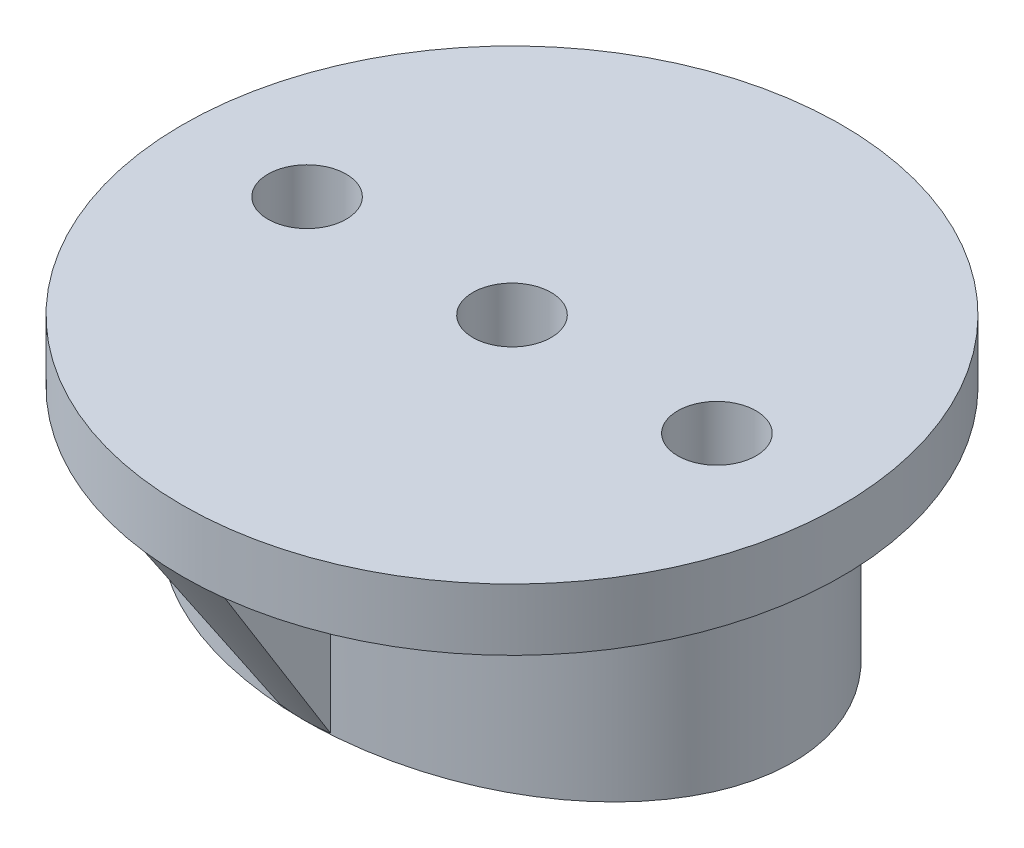
ISO-10303-21;
HEADER;
FILE_DESCRIPTION(('STEP AP214'),'2;1');
FILE_NAME('part.step','',(''),(''),'','','');
FILE_SCHEMA(('AUTOMOTIVE_DESIGN { 1 0 10303 214 1 1 1 1 }'));
ENDSEC;
DATA;
#1=APPLICATION_CONTEXT('core data for automotive mechanical design processes');
#2=APPLICATION_PROTOCOL_DEFINITION('international standard','automotive_design',2000,#1);
#3=PRODUCT_CONTEXT('',#1,'mechanical');
#4=PRODUCT('Part','Part','',(#3));
#5=PRODUCT_RELATED_PRODUCT_CATEGORY('part','',(#4));
#6=PRODUCT_DEFINITION_FORMATION('','',#4);
#7=PRODUCT_DEFINITION_CONTEXT('part definition',#1,'design');
#8=PRODUCT_DEFINITION('design','',#6,#7);
#9=PRODUCT_DEFINITION_SHAPE('','',#8);
#10=(LENGTH_UNIT() NAMED_UNIT(*) SI_UNIT(.MILLI.,.METRE.));
#11=(NAMED_UNIT(*) PLANE_ANGLE_UNIT() SI_UNIT($,.RADIAN.));
#12=(NAMED_UNIT(*) SI_UNIT($,.STERADIAN.) SOLID_ANGLE_UNIT());
#13=UNCERTAINTY_MEASURE_WITH_UNIT(LENGTH_MEASURE(1.E-05),#10,'distance_accuracy_value','');
#14=(GEOMETRIC_REPRESENTATION_CONTEXT(3) GLOBAL_UNCERTAINTY_ASSIGNED_CONTEXT((#13)) GLOBAL_UNIT_ASSIGNED_CONTEXT((#10,
#11,#12)) REPRESENTATION_CONTEXT('',''));
#15=CARTESIAN_POINT('',(0.,0.,0.));
#16=DIRECTION('',(0.,0.,1.));
#17=DIRECTION('',(1.,0.,0.));
#18=AXIS2_PLACEMENT_3D('',#15,#16,#17);
#19=CARTESIAN_POINT('',(0.,57.254833995939,0.));
#20=DIRECTION('',(0.,-1.,0.));
#21=DIRECTION('',(-1.,0.,0.));
#22=AXIS2_PLACEMENT_3D('',#19,#20,#21);
#23=ELLIPSE('',#22,13.6302171389891,10.0863606828519);
#24=DIRECTION('',(0.,-1.,0.));
#25=VECTOR('',#24,1.);
#26=SURFACE_OF_LINEAR_EXTRUSION('',#23,#25);
#27=CARTESIAN_POINT('',(1.233368705494,0.0518321276191582,-10.0449820109657));
#28=CARTESIAN_POINT('',(1.13072295889144,0.0432177595437114,-10.0518839833739));
#29=CARTESIAN_POINT('',(1.02793007242528,0.0356620341411071,-10.0579263881112));
#30=CARTESIAN_POINT('',(0.822343982897428,0.0227060251169006,-10.0682747195089));
#31=CARTESIAN_POINT('',(0.7195512563392,0.0173011390424472,-10.072584354228));
#32=CARTESIAN_POINT('',(0.513965318761181,0.00865393201673197,-10.0794745810961));
#33=CARTESIAN_POINT('',(0.411172321731632,0.0054085071540511,-10.0820576549497));
#34=CARTESIAN_POINT('',(0.205586180671322,0.0010823217772041,-10.0855000842118));
#35=CARTESIAN_POINT('',(0.102793090335661,0.,-10.0863606828519));
#36=CARTESIAN_POINT('',(-0.10279309033566,0.,-10.0863606828519));
#37=CARTESIAN_POINT('',(-0.20558618067132,0.00108232177720389,-10.0855000842118));
#38=CARTESIAN_POINT('',(-0.41117232173163,0.00540850715405112,-10.0820576549497));
#39=CARTESIAN_POINT('',(-0.513965318761179,0.00865393201673235,-10.0794745810961));
#40=CARTESIAN_POINT('',(-0.719551256339198,0.0173011390424493,-10.072584354228));
#41=CARTESIAN_POINT('',(-0.822343982897426,0.0227060251169041,-10.0682747195089));
#42=CARTESIAN_POINT('',(-1.02793007242528,0.03566203414111,-10.0579263881112));
#43=CARTESIAN_POINT('',(-1.13072295889144,0.0432177595437122,-10.0518839833739));
#44=CARTESIAN_POINT('',(-1.233368705494,0.051832127619153,-10.0449820109657));
#45=B_SPLINE_CURVE_WITH_KNOTS('',3,(#27,#28,#29,#30,#31,#32,#33,#34,#35,#36,#37,#38,#39,#40,#41,
#42,#43,#44),.UNSPECIFIED.,.F.,.F.,(4,2,2,2,2,2,2,2,4),(0.,0.309704305783665,0.61874228348996,
0.927335098939476,1.23570510077978,1.54407510262009,1.85266791806961,2.1617058957759,
2.47141020155957),.UNSPECIFIED.);
#46=CARTESIAN_POINT('',(0.,0.,-10.0863606828519));
#47=VERTEX_POINT('',#46);
#48=CARTESIAN_POINT('',(-1.233368705494,0.0518321276191591,-10.0449820109657));
#49=VERTEX_POINT('',#48);
#50=EDGE_CURVE('E194',#47,#49,#45,.T.);
#51=ORIENTED_EDGE('',*,*,#50,.F.);
#52=CARTESIAN_POINT('',(0.,0.,0.));
#53=DIRECTION('',(0.,-1.,0.));
#54=DIRECTION('',(-1.,0.,0.));
#55=AXIS2_PLACEMENT_3D('',#52,#53,#54);
#56=ELLIPSE('',#55,13.6302171389891,10.0863606828519);
#57=CARTESIAN_POINT('',(0.,0.,10.0863606828519));
#58=VERTEX_POINT('',#57);
#59=EDGE_CURVE('E241',#58,#47,#56,.T.);
#60=ORIENTED_EDGE('',*,*,#59,.F.);
#61=CARTESIAN_POINT('',(-1.233368705494,0.0518321276191591,10.0449820109657));
#62=CARTESIAN_POINT('',(-1.13072295889144,0.0432177595437092,10.0518839833739));
#63=CARTESIAN_POINT('',(-1.02793007242528,0.0356620341411055,10.0579263881112));
#64=CARTESIAN_POINT('',(-0.822343982897427,0.0227060251169015,10.0682747195089));
#65=CARTESIAN_POINT('',(-0.719551256339198,0.0173011390424502,10.072584354228));
#66=CARTESIAN_POINT('',(-0.513965318761179,0.00865393201673461,10.0794745810961));
#67=CARTESIAN_POINT('',(-0.41117232173163,0.00540850715405144,10.0820576549497));
#68=CARTESIAN_POINT('',(-0.20558618067132,0.0010823217772029,10.0855000842118));
#69=CARTESIAN_POINT('',(-0.102793090335659,0.,10.0863606828519));
#70=CARTESIAN_POINT('',(0.102793090335663,0.,10.0863606828519));
#71=CARTESIAN_POINT('',(0.205586180671323,0.00108232177720485,10.0855000842118));
#72=CARTESIAN_POINT('',(0.411172321731634,0.00540850715405157,10.0820576549497));
#73=CARTESIAN_POINT('',(0.513965318761183,0.00865393201673194,10.0794745810961));
#74=CARTESIAN_POINT('',(0.719551256339202,0.0173011390424469,10.072584354228));
#75=CARTESIAN_POINT('',(0.822343982897431,0.0227060251169006,10.0682747195089));
#76=CARTESIAN_POINT('',(1.02793007242529,0.035662034141108,10.0579263881112));
#77=CARTESIAN_POINT('',(1.13072295889145,0.0432177595437127,10.0518839833739));
#78=CARTESIAN_POINT('',(1.233368705494,0.05183212761916,10.0449820109657));
#79=B_SPLINE_CURVE_WITH_KNOTS('',3,(#61,#62,#63,#64,#65,#66,#67,#68,#69,#70,#71,#72,#73,#74,#75,
#76,#77,#78),.UNSPECIFIED.,.F.,.F.,(4,2,2,2,2,2,2,2,4),(0.,0.309704305783665,0.618742283489962,
0.927335098939477,1.23570510077979,1.54407510262009,1.85266791806961,2.16170589577591,
2.47141020155957),.UNSPECIFIED.);
#80=CARTESIAN_POINT('',(-1.233368705494,0.0518321276191591,10.0449820109657));
#81=VERTEX_POINT('',#80);
#82=EDGE_CURVE('E238',#81,#58,#79,.T.);
#83=ORIENTED_EDGE('',*,*,#82,.F.);
#84=DIRECTION('',(0.,-1.,0.));
#85=VECTOR('',#84,1.);
#86=CARTESIAN_POINT('',(-1.233368705494,4.5,10.0449820109657));
#87=LINE('',#86,#85);
#88=CARTESIAN_POINT('',(-1.233368705494,9.,10.0449820109657));
#89=VERTEX_POINT('',#88);
#90=EDGE_CURVE('E239',#81,#89,#87,.F.);
#91=ORIENTED_EDGE('',*,*,#90,.T.);
#92=CARTESIAN_POINT('',(0.,9.,0.));
#93=DIRECTION('',(0.,-1.,0.));
#94=DIRECTION('',(-1.,0.,0.));
#95=AXIS2_PLACEMENT_3D('',#92,#93,#94);
#96=ELLIPSE('',#95,13.6302171389891,10.0863606828519);
#97=CARTESIAN_POINT('',(-1.233368705494,9.,-10.0449820109657));
#98=VERTEX_POINT('',#97);
#99=EDGE_CURVE('E246',#89,#98,#96,.T.);
#100=ORIENTED_EDGE('',*,*,#99,.T.);
#101=DIRECTION('',(0.,-1.,0.));
#102=VECTOR('',#101,1.);
#103=CARTESIAN_POINT('',(-1.233368705494,4.49999999999985,-10.0449820109657));
#104=LINE('',#103,#102);
#105=EDGE_CURVE('E59',#98,#49,#104,.T.);
#106=ORIENTED_EDGE('',*,*,#105,.T.);
#107=EDGE_LOOP('',(#51,#60,#83,#91,#100,#106));
#108=FACE_BOUND('',#107,.T.);
#109=ADVANCED_FACE('F35',(#108),#26,.T.);
#110=CARTESIAN_POINT('',(0.,9.,0.));
#111=DIRECTION('',(0.,1.,0.));
#112=DIRECTION('',(0.,0.,1.));
#113=AXIS2_PLACEMENT_3D('',#110,#111,#112);
#114=PLANE('',#113);
#115=DIRECTION('',(-0.121869343405148,0.,-0.992546151641322));
#116=VECTOR('',#115,1.);
#117=CARTESIAN_POINT('',(-1.94990949448236,9.,-15.8807384262612));
#118=LINE('',#117,#116);
#119=CARTESIAN_POINT('',(-1.94990949448236,9.,-15.8807384262612));
#120=VERTEX_POINT('',#119);
#121=EDGE_CURVE('E185',#98,#120,#118,.T.);
#122=ORIENTED_EDGE('',*,*,#121,.F.);
#123=ORIENTED_EDGE('',*,*,#99,.F.);
#124=DIRECTION('',(0.121869343405148,0.,-0.992546151641322));
#125=VECTOR('',#124,1.);
#126=CARTESIAN_POINT('',(0.,9.,0.));
#127=LINE('',#126,#125);
#128=CARTESIAN_POINT('',(-1.94990949448236,9.,15.8807384262612));
#129=VERTEX_POINT('',#128);
#130=EDGE_CURVE('E12',#129,#89,#127,.T.);
#131=ORIENTED_EDGE('',*,*,#130,.F.);
#132=CARTESIAN_POINT('',(0.,9.,0.));
#133=DIRECTION('',(0.,1.,0.));
#134=DIRECTION('',(0.,0.,1.));
#135=AXIS2_PLACEMENT_3D('',#132,#133,#134);
#136=CIRCLE('',#135,16.);
#137=EDGE_CURVE('E249',#129,#120,#136,.F.);
#138=ORIENTED_EDGE('',*,*,#137,.T.);
#139=EDGE_LOOP('',(#122,#123,#131,#138));
#140=FACE_BOUND('',#139,.T.);
#141=ADVANCED_FACE('F312',(#140),#114,.F.);
#142=CARTESIAN_POINT('',(1.233368705494,0.0518321276191626,-10.0449820109657));
#143=VERTEX_POINT('',#142);
#144=EDGE_CURVE('E202',#143,#47,#45,.T.);
#145=ORIENTED_EDGE('',*,*,#144,.F.);
#146=DIRECTION('',(0.,-1.,0.));
#147=VECTOR('',#146,1.);
#148=CARTESIAN_POINT('',(1.233368705494,4.49999999999985,-10.0449820109657));
#149=LINE('',#148,#147);
#150=CARTESIAN_POINT('',(1.233368705494,9.,-10.0449820109657));
#151=VERTEX_POINT('',#150);
#152=EDGE_CURVE('E203',#151,#143,#149,.T.);
#153=ORIENTED_EDGE('',*,*,#152,.F.);
#154=CARTESIAN_POINT('',(1.233368705494,9.,10.0449820109657));
#155=VERTEX_POINT('',#154);
#156=EDGE_CURVE('E244',#151,#155,#96,.T.);
#157=ORIENTED_EDGE('',*,*,#156,.T.);
#158=DIRECTION('',(0.,-1.,0.));
#159=VECTOR('',#158,1.);
#160=CARTESIAN_POINT('',(1.233368705494,4.5,10.0449820109657));
#161=LINE('',#160,#159);
#162=CARTESIAN_POINT('',(1.233368705494,0.0518321276191626,10.0449820109657));
#163=VERTEX_POINT('',#162);
#164=EDGE_CURVE('E282',#163,#155,#161,.F.);
#165=ORIENTED_EDGE('',*,*,#164,.F.);
#166=EDGE_CURVE('E231',#58,#163,#79,.T.);
#167=ORIENTED_EDGE('',*,*,#166,.F.);
#168=EDGE_CURVE('E245',#47,#58,#56,.T.);
#169=ORIENTED_EDGE('',*,*,#168,.F.);
#170=EDGE_LOOP('',(#145,#153,#157,#165,#167,#169));
#171=FACE_BOUND('',#170,.T.);
#172=ADVANCED_FACE('F205',(#171),#26,.T.);
#173=ORIENTED_EDGE('',*,*,#156,.F.);
#174=DIRECTION('',(0.121869343405148,0.,-0.992546151641322));
#175=VECTOR('',#174,1.);
#176=CARTESIAN_POINT('',(1.94990949448236,9.,-15.8807384262612));
#177=LINE('',#176,#175);
#178=CARTESIAN_POINT('',(1.94990949448236,9.,-15.8807384262612));
#179=VERTEX_POINT('',#178);
#180=EDGE_CURVE('E179',#151,#179,#177,.T.);
#181=ORIENTED_EDGE('',*,*,#180,.T.);
#182=CARTESIAN_POINT('',(1.94990949448236,9.,15.8807384262612));
#183=VERTEX_POINT('',#182);
#184=EDGE_CURVE('E251',#179,#183,#136,.F.);
#185=ORIENTED_EDGE('',*,*,#184,.T.);
#186=DIRECTION('',(-0.121869343405148,0.,-0.992546151641322));
#187=VECTOR('',#186,1.);
#188=CARTESIAN_POINT('',(0.,9.,0.));
#189=LINE('',#188,#187);
#190=EDGE_CURVE('E44',#183,#155,#189,.T.);
#191=ORIENTED_EDGE('',*,*,#190,.T.);
#192=EDGE_LOOP('',(#173,#181,#185,#191));
#193=FACE_BOUND('',#192,.T.);
#194=ADVANCED_FACE('F275',(#193),#114,.F.);
#195=CARTESIAN_POINT('',(0.,0.,0.));
#196=DIRECTION('',(0.,1.,0.));
#197=DIRECTION('',(0.,0.,1.));
#198=AXIS2_PLACEMENT_3D('',#195,#196,#197);
#199=PLANE('',#198);
#200=DIRECTION('',(-0.5,0.,-0.866025403784439));
#201=VECTOR('',#200,1.);
#202=CARTESIAN_POINT('',(-3.46410161513775,0.,6.));
#203=LINE('',#202,#201);
#204=CARTESIAN_POINT('',(-3.46410161513775,0.,6.));
#205=VERTEX_POINT('',#204);
#206=CARTESIAN_POINT('',(-6.92820323027551,0.,0.));
#207=VERTEX_POINT('',#206);
#208=EDGE_CURVE('E515',#205,#207,#203,.T.);
#209=ORIENTED_EDGE('',*,*,#208,.F.);
#210=DIRECTION('',(-1.,0.,0.));
#211=VECTOR('',#210,1.);
#212=CARTESIAN_POINT('',(3.46410161513776,0.,6.));
#213=LINE('',#212,#211);
#214=CARTESIAN_POINT('',(3.46410161513776,0.,6.));
#215=VERTEX_POINT('',#214);
#216=EDGE_CURVE('E148',#215,#205,#213,.T.);
#217=ORIENTED_EDGE('',*,*,#216,.F.);
#218=DIRECTION('',(-0.5,0.,0.866025403784439));
#219=VECTOR('',#218,1.);
#220=CARTESIAN_POINT('',(6.92820323027551,0.,0.));
#221=LINE('',#220,#219);
#222=CARTESIAN_POINT('',(6.92820323027551,0.,0.));
#223=VERTEX_POINT('',#222);
#224=EDGE_CURVE('E160',#223,#215,#221,.T.);
#225=ORIENTED_EDGE('',*,*,#224,.F.);
#226=DIRECTION('',(0.5,0.,0.866025403784439));
#227=VECTOR('',#226,1.);
#228=CARTESIAN_POINT('',(3.46410161513775,0.,-6.));
#229=LINE('',#228,#227);
#230=CARTESIAN_POINT('',(3.46410161513775,0.,-6.));
#231=VERTEX_POINT('',#230);
#232=EDGE_CURVE('E51',#231,#223,#229,.T.);
#233=ORIENTED_EDGE('',*,*,#232,.F.);
#234=DIRECTION('',(1.,0.,0.));
#235=VECTOR('',#234,1.);
#236=CARTESIAN_POINT('',(-3.46410161513775,0.,-6.));
#237=LINE('',#236,#235);
#238=CARTESIAN_POINT('',(-3.46410161513775,0.,-6.));
#239=VERTEX_POINT('',#238);
#240=EDGE_CURVE('E156',#239,#231,#237,.T.);
#241=ORIENTED_EDGE('',*,*,#240,.F.);
#242=DIRECTION('',(0.5,0.,-0.866025403784439));
#243=VECTOR('',#242,1.);
#244=CARTESIAN_POINT('',(-6.92820323027551,0.,0.));
#245=LINE('',#244,#243);
#246=EDGE_CURVE('E516',#207,#239,#245,.T.);
#247=ORIENTED_EDGE('',*,*,#246,.F.);
#248=EDGE_LOOP('',(#209,#217,#225,#233,#241,#247));
#249=FACE_BOUND('',#248,.T.);
#250=ORIENTED_EDGE('',*,*,#59,.T.);
#251=ORIENTED_EDGE('',*,*,#168,.T.);
#252=EDGE_LOOP('',(#250,#251));
#253=FACE_BOUND('',#252,.T.);
#254=CARTESIAN_POINT('',(9.95,0.,0.));
#255=DIRECTION('',(0.,1.,0.));
#256=DIRECTION('',(0.,0.,1.));
#257=AXIS2_PLACEMENT_3D('',#254,#255,#256);
#258=CIRCLE('',#257,1.9);
#259=CARTESIAN_POINT('',(9.95,0.,1.89999999999999));
#260=VERTEX_POINT('',#259);
#261=EDGE_CURVE('E248',#260,#260,#258,.T.);
#262=ORIENTED_EDGE('',*,*,#261,.T.);
#263=EDGE_LOOP('',(#262));
#264=FACE_BOUND('',#263,.T.);
#265=CARTESIAN_POINT('',(-9.95,0.,0.));
#266=DIRECTION('',(0.,1.,0.));
#267=DIRECTION('',(0.,0.,1.));
#268=AXIS2_PLACEMENT_3D('',#265,#266,#267);
#269=CIRCLE('',#268,1.9);
#270=CARTESIAN_POINT('',(-9.95,0.,1.9));
#271=VERTEX_POINT('',#270);
#272=EDGE_CURVE('E257',#271,#271,#269,.T.);
#273=ORIENTED_EDGE('',*,*,#272,.T.);
#274=EDGE_LOOP('',(#273));
#275=FACE_BOUND('',#274,.T.);
#276=ADVANCED_FACE('F305',(#249,#253,#264,#275),#199,.F.);
#277=CARTESIAN_POINT('',(0.,12.,0.));
#278=DIRECTION('',(0.,1.,0.));
#279=DIRECTION('',(0.,0.,1.));
#280=AXIS2_PLACEMENT_3D('',#277,#278,#279);
#281=PLANE('',#280);
#282=CARTESIAN_POINT('',(-9.95,12.,0.));
#283=DIRECTION('',(0.,1.,0.));
#284=DIRECTION('',(0.,0.,1.));
#285=AXIS2_PLACEMENT_3D('',#282,#283,#284);
#286=CIRCLE('',#285,1.9);
#287=CARTESIAN_POINT('',(-9.95,12.,1.9));
#288=VERTEX_POINT('',#287);
#289=EDGE_CURVE('E260',#288,#288,#286,.T.);
#290=ORIENTED_EDGE('',*,*,#289,.F.);
#291=EDGE_LOOP('',(#290));
#292=FACE_BOUND('',#291,.T.);
#293=CARTESIAN_POINT('',(0.,12.,0.));
#294=DIRECTION('',(0.,1.,0.));
#295=DIRECTION('',(0.,0.,1.));
#296=AXIS2_PLACEMENT_3D('',#293,#294,#295);
#297=CIRCLE('',#296,16.);
#298=CARTESIAN_POINT('',(0.,12.,16.));
#299=VERTEX_POINT('',#298);
#300=EDGE_CURVE('E268',#299,#299,#297,.T.);
#301=ORIENTED_EDGE('',*,*,#300,.T.);
#302=EDGE_LOOP('',(#301));
#303=FACE_BOUND('',#302,.T.);
#304=CARTESIAN_POINT('',(0.,12.,0.));
#305=DIRECTION('',(0.,1.,0.));
#306=DIRECTION('',(0.,0.,1.));
#307=AXIS2_PLACEMENT_3D('',#304,#305,#306);
#308=CIRCLE('',#307,1.9);
#309=CARTESIAN_POINT('',(0.,12.,1.9));
#310=VERTEX_POINT('',#309);
#311=EDGE_CURVE('E263',#310,#310,#308,.T.);
#312=ORIENTED_EDGE('',*,*,#311,.F.);
#313=EDGE_LOOP('',(#312));
#314=FACE_BOUND('',#313,.T.);
#315=CARTESIAN_POINT('',(9.95,12.,0.));
#316=DIRECTION('',(0.,1.,0.));
#317=DIRECTION('',(0.,0.,1.));
#318=AXIS2_PLACEMENT_3D('',#315,#316,#317);
#319=CIRCLE('',#318,1.9);
#320=CARTESIAN_POINT('',(9.95,12.,1.89999999999999));
#321=VERTEX_POINT('',#320);
#322=EDGE_CURVE('E254',#321,#321,#319,.T.);
#323=ORIENTED_EDGE('',*,*,#322,.F.);
#324=EDGE_LOOP('',(#323));
#325=FACE_BOUND('',#324,.T.);
#326=ADVANCED_FACE('F330',(#292,#303,#314,#325),#281,.T.);
#327=CARTESIAN_POINT('',(0.,12.,0.));
#328=DIRECTION('',(0.,-1.,0.));
#329=DIRECTION('',(0.,0.,-1.));
#330=AXIS2_PLACEMENT_3D('',#327,#328,#329);
#331=CYLINDRICAL_SURFACE('',#330,16.);
#332=ORIENTED_EDGE('',*,*,#137,.F.);
#333=CARTESIAN_POINT('',(0.,9.,0.));
#334=DIRECTION('',(0.,1.,0.));
#335=DIRECTION('',(0.,0.,1.));
#336=AXIS2_PLACEMENT_3D('',#333,#334,#335);
#337=CIRCLE('',#336,16.);
#338=EDGE_CURVE('E285',#129,#183,#337,.T.);
#339=ORIENTED_EDGE('',*,*,#338,.T.);
#340=ORIENTED_EDGE('',*,*,#184,.F.);
#341=CARTESIAN_POINT('',(0.,9.,0.));
#342=DIRECTION('',(0.,-1.,0.));
#343=DIRECTION('',(0.,0.,-1.));
#344=AXIS2_PLACEMENT_3D('',#341,#342,#343);
#345=CIRCLE('',#344,16.);
#346=EDGE_CURVE('E191',#120,#179,#345,.T.);
#347=ORIENTED_EDGE('',*,*,#346,.F.);
#348=EDGE_LOOP('',(#332,#339,#340,#347));
#349=FACE_BOUND('',#348,.T.);
#350=ORIENTED_EDGE('',*,*,#300,.F.);
#351=EDGE_LOOP('',(#350));
#352=FACE_BOUND('',#351,.T.);
#353=ADVANCED_FACE('F37',(#349,#352),#331,.T.);
#354=CARTESIAN_POINT('',(0.,12.,0.));
#355=DIRECTION('',(0.,-1.,0.));
#356=DIRECTION('',(0.,0.,-1.));
#357=AXIS2_PLACEMENT_3D('',#354,#355,#356);
#358=CYLINDRICAL_SURFACE('',#357,1.9);
#359=CARTESIAN_POINT('',(0.,9.,0.));
#360=DIRECTION('',(0.,1.,0.));
#361=DIRECTION('',(0.,0.,1.));
#362=AXIS2_PLACEMENT_3D('',#359,#360,#361);
#363=CIRCLE('',#362,1.9);
#364=CARTESIAN_POINT('',(0.,9.,1.9));
#365=VERTEX_POINT('',#364);
#366=EDGE_CURVE('E39',#365,#365,#363,.T.);
#367=ORIENTED_EDGE('',*,*,#366,.F.);
#368=EDGE_LOOP('',(#367));
#369=FACE_BOUND('',#368,.T.);
#370=ORIENTED_EDGE('',*,*,#311,.T.);
#371=EDGE_LOOP('',(#370));
#372=FACE_BOUND('',#371,.T.);
#373=ADVANCED_FACE('F339',(#369,#372),#358,.F.);
#374=CARTESIAN_POINT('',(-9.95,12.,0.));
#375=DIRECTION('',(0.,-1.,0.));
#376=DIRECTION('',(0.,0.,-1.));
#377=AXIS2_PLACEMENT_3D('',#374,#375,#376);
#378=CYLINDRICAL_SURFACE('',#377,1.9);
#379=ORIENTED_EDGE('',*,*,#289,.T.);
#380=EDGE_LOOP('',(#379));
#381=FACE_BOUND('',#380,.T.);
#382=ORIENTED_EDGE('',*,*,#272,.F.);
#383=EDGE_LOOP('',(#382));
#384=FACE_BOUND('',#383,.T.);
#385=ADVANCED_FACE('F335',(#381,#384),#378,.F.);
#386=CARTESIAN_POINT('',(9.95,12.,0.));
#387=DIRECTION('',(0.,-1.,0.));
#388=DIRECTION('',(0.,0.,-1.));
#389=AXIS2_PLACEMENT_3D('',#386,#387,#388);
#390=CYLINDRICAL_SURFACE('',#389,1.9);
#391=ORIENTED_EDGE('',*,*,#322,.T.);
#392=EDGE_LOOP('',(#391));
#393=FACE_BOUND('',#392,.T.);
#394=ORIENTED_EDGE('',*,*,#261,.F.);
#395=EDGE_LOOP('',(#394));
#396=FACE_BOUND('',#395,.T.);
#397=ADVANCED_FACE('F228',(#393,#396),#390,.F.);
#398=CARTESIAN_POINT('',(0.,9.,0.));
#399=DIRECTION('',(0.,1.,0.));
#400=DIRECTION('',(0.,0.,1.));
#401=AXIS2_PLACEMENT_3D('',#398,#399,#400);
#402=CONICAL_SURFACE('',#401,16.,0.581330021471508);
#403=DIRECTION('',(0.0669228394987273,-0.835733026694078,-0.545042788821375));
#404=VECTOR('',#403,1.);
#405=CARTESIAN_POINT('',(-1.22921815376666,0.,10.011178479831));
#406=LINE('',#405,#404);
#407=EDGE_CURVE('E289',#129,#81,#406,.T.);
#408=ORIENTED_EDGE('',*,*,#407,.T.);
#409=ORIENTED_EDGE('',*,*,#82,.T.);
#410=ORIENTED_EDGE('',*,*,#166,.T.);
#411=DIRECTION('',(-0.0669228394987273,-0.835733026694078,-0.545042788821375));
#412=VECTOR('',#411,1.);
#413=CARTESIAN_POINT('',(1.22921815376666,0.,10.011178479831));
#414=LINE('',#413,#412);
#415=EDGE_CURVE('E280',#183,#163,#414,.T.);
#416=ORIENTED_EDGE('',*,*,#415,.F.);
#417=ORIENTED_EDGE('',*,*,#338,.F.);
#418=EDGE_LOOP('',(#408,#409,#410,#416,#417));
#419=FACE_BOUND('',#418,.T.);
#420=ADVANCED_FACE('F224',(#419),#402,.T.);
#421=CARTESIAN_POINT('',(0.,0.,0.));
#422=DIRECTION('',(0.992546151641322,0.,0.121869343405148));
#423=DIRECTION('',(0.121869343405148,0.,-0.992546151641322));
#424=AXIS2_PLACEMENT_3D('',#421,#422,#423);
#425=PLANE('',#424);
#426=ORIENTED_EDGE('',*,*,#90,.F.);
#427=ORIENTED_EDGE('',*,*,#407,.F.);
#428=ORIENTED_EDGE('',*,*,#130,.T.);
#429=EDGE_LOOP('',(#426,#427,#428));
#430=FACE_BOUND('',#429,.T.);
#431=ADVANCED_FACE('F221',(#430),#425,.F.);
#432=CARTESIAN_POINT('',(0.,0.,0.));
#433=DIRECTION('',(0.992546151641322,0.,-0.121869343405148));
#434=DIRECTION('',(-0.121869343405148,0.,-0.992546151641322));
#435=AXIS2_PLACEMENT_3D('',#432,#433,#434);
#436=PLANE('',#435);
#437=ORIENTED_EDGE('',*,*,#415,.T.);
#438=ORIENTED_EDGE('',*,*,#164,.T.);
#439=ORIENTED_EDGE('',*,*,#190,.F.);
#440=EDGE_LOOP('',(#437,#438,#439));
#441=FACE_BOUND('',#440,.T.);
#442=ADVANCED_FACE('F216',(#441),#436,.T.);
#443=CARTESIAN_POINT('',(0.,9.,0.));
#444=DIRECTION('',(0.,1.,0.));
#445=DIRECTION('',(0.,0.,-1.));
#446=AXIS2_PLACEMENT_3D('',#443,#444,#445);
#447=CONICAL_SURFACE('',#446,16.,0.581330021471508);
#448=DIRECTION('',(-0.0669228394987273,-0.835733026694078,0.545042788821375));
#449=VECTOR('',#448,1.);
#450=CARTESIAN_POINT('',(1.22921815376666,0.,-10.011178479831));
#451=LINE('',#450,#449);
#452=EDGE_CURVE('E182',#179,#143,#451,.T.);
#453=ORIENTED_EDGE('',*,*,#452,.T.);
#454=ORIENTED_EDGE('',*,*,#144,.T.);
#455=ORIENTED_EDGE('',*,*,#50,.T.);
#456=DIRECTION('',(0.0669228394987273,-0.835733026694078,0.545042788821375));
#457=VECTOR('',#456,1.);
#458=CARTESIAN_POINT('',(-1.22921815376666,0.,-10.011178479831));
#459=LINE('',#458,#457);
#460=EDGE_CURVE('E188',#120,#49,#459,.T.);
#461=ORIENTED_EDGE('',*,*,#460,.F.);
#462=ORIENTED_EDGE('',*,*,#346,.T.);
#463=EDGE_LOOP('',(#453,#454,#455,#461,#462));
#464=FACE_BOUND('',#463,.T.);
#465=ADVANCED_FACE('F210',(#464),#447,.T.);
#466=CARTESIAN_POINT('',(0.,0.,0.));
#467=DIRECTION('',(0.992546151641322,0.,-0.121869343405148));
#468=DIRECTION('',(0.121869343405148,0.,0.992546151641322));
#469=AXIS2_PLACEMENT_3D('',#466,#467,#468);
#470=PLANE('',#469);
#471=ORIENTED_EDGE('',*,*,#105,.F.);
#472=ORIENTED_EDGE('',*,*,#121,.T.);
#473=ORIENTED_EDGE('',*,*,#460,.T.);
#474=EDGE_LOOP('',(#471,#472,#473));
#475=FACE_BOUND('',#474,.T.);
#476=ADVANCED_FACE('F215',(#475),#470,.F.);
#477=CARTESIAN_POINT('',(0.,0.,0.));
#478=DIRECTION('',(0.992546151641322,0.,0.121869343405148));
#479=DIRECTION('',(-0.121869343405148,0.,0.992546151641322));
#480=AXIS2_PLACEMENT_3D('',#477,#478,#479);
#481=PLANE('',#480);
#482=ORIENTED_EDGE('',*,*,#180,.F.);
#483=ORIENTED_EDGE('',*,*,#152,.T.);
#484=ORIENTED_EDGE('',*,*,#452,.F.);
#485=EDGE_LOOP('',(#482,#483,#484));
#486=FACE_BOUND('',#485,.T.);
#487=ADVANCED_FACE('F315',(#486),#481,.T.);
#488=CARTESIAN_POINT('',(0.,9.,0.));
#489=DIRECTION('',(0.,1.,0.));
#490=DIRECTION('',(0.,0.,1.));
#491=AXIS2_PLACEMENT_3D('',#488,#489,#490);
#492=PLANE('',#491);
#493=ORIENTED_EDGE('',*,*,#366,.T.);
#494=EDGE_LOOP('',(#493));
#495=FACE_BOUND('',#494,.T.);
#496=DIRECTION('',(-0.5,0.,0.866025403784439));
#497=VECTOR('',#496,1.);
#498=CARTESIAN_POINT('',(6.92820323027551,9.,0.));
#499=LINE('',#498,#497);
#500=CARTESIAN_POINT('',(6.92820323027551,9.,0.));
#501=VERTEX_POINT('',#500);
#502=CARTESIAN_POINT('',(3.46410161513776,9.,6.));
#503=VERTEX_POINT('',#502);
#504=EDGE_CURVE('E153',#501,#503,#499,.T.);
#505=ORIENTED_EDGE('',*,*,#504,.T.);
#506=DIRECTION('',(-1.,0.,0.));
#507=VECTOR('',#506,1.);
#508=CARTESIAN_POINT('',(3.46410161513776,9.,6.));
#509=LINE('',#508,#507);
#510=CARTESIAN_POINT('',(-3.46410161513775,9.,6.));
#511=VERTEX_POINT('',#510);
#512=EDGE_CURVE('E145',#503,#511,#509,.T.);
#513=ORIENTED_EDGE('',*,*,#512,.T.);
#514=DIRECTION('',(-0.5,0.,-0.866025403784439));
#515=VECTOR('',#514,1.);
#516=CARTESIAN_POINT('',(-3.46410161513775,9.,6.));
#517=LINE('',#516,#515);
#518=CARTESIAN_POINT('',(-6.92820323027551,9.,0.));
#519=VERTEX_POINT('',#518);
#520=EDGE_CURVE('E132',#511,#519,#517,.T.);
#521=ORIENTED_EDGE('',*,*,#520,.T.);
#522=DIRECTION('',(0.5,0.,-0.866025403784439));
#523=VECTOR('',#522,1.);
#524=CARTESIAN_POINT('',(-6.92820323027551,9.,0.));
#525=LINE('',#524,#523);
#526=CARTESIAN_POINT('',(-3.46410161513775,9.,-6.));
#527=VERTEX_POINT('',#526);
#528=EDGE_CURVE('E172',#519,#527,#525,.T.);
#529=ORIENTED_EDGE('',*,*,#528,.T.);
#530=DIRECTION('',(1.,0.,0.));
#531=VECTOR('',#530,1.);
#532=CARTESIAN_POINT('',(-3.46410161513775,9.,-6.));
#533=LINE('',#532,#531);
#534=CARTESIAN_POINT('',(3.46410161513775,9.,-6.));
#535=VERTEX_POINT('',#534);
#536=EDGE_CURVE('E168',#527,#535,#533,.T.);
#537=ORIENTED_EDGE('',*,*,#536,.T.);
#538=DIRECTION('',(0.5,0.,0.866025403784439));
#539=VECTOR('',#538,1.);
#540=CARTESIAN_POINT('',(3.46410161513775,9.,-6.));
#541=LINE('',#540,#539);
#542=EDGE_CURVE('E165',#535,#501,#541,.T.);
#543=ORIENTED_EDGE('',*,*,#542,.T.);
#544=EDGE_LOOP('',(#505,#513,#521,#529,#537,#543));
#545=FACE_BOUND('',#544,.T.);
#546=ADVANCED_FACE('F151',(#495,#545),#492,.F.);
#547=CARTESIAN_POINT('',(3.46410161513776,30.3303027798234,6.));
#548=DIRECTION('',(0.,0.,1.));
#549=DIRECTION('',(1.,0.,0.));
#550=AXIS2_PLACEMENT_3D('',#547,#548,#549);
#551=PLANE('',#550);
#552=DIRECTION('',(0.,-1.,0.));
#553=VECTOR('',#552,1.);
#554=CARTESIAN_POINT('',(3.46410161513776,30.3303027798234,6.));
#555=LINE('',#554,#553);
#556=EDGE_CURVE('E163',#503,#215,#555,.T.);
#557=ORIENTED_EDGE('',*,*,#556,.T.);
#558=ORIENTED_EDGE('',*,*,#216,.T.);
#559=DIRECTION('',(0.,-1.,0.));
#560=VECTOR('',#559,1.);
#561=CARTESIAN_POINT('',(-3.46410161513775,30.3303027798234,6.));
#562=LINE('',#561,#560);
#563=EDGE_CURVE('E136',#511,#205,#562,.T.);
#564=ORIENTED_EDGE('',*,*,#563,.F.);
#565=ORIENTED_EDGE('',*,*,#512,.F.);
#566=EDGE_LOOP('',(#557,#558,#564,#565));
#567=FACE_BOUND('',#566,.T.);
#568=ADVANCED_FACE('F144',(#567),#551,.F.);
#569=CARTESIAN_POINT('',(-3.46410161513775,30.3303027798234,6.));
#570=DIRECTION('',(-0.866025403784439,0.,0.5));
#571=DIRECTION('',(0.5,0.,0.866025403784439));
#572=AXIS2_PLACEMENT_3D('',#569,#570,#571);
#573=PLANE('',#572);
#574=ORIENTED_EDGE('',*,*,#563,.T.);
#575=ORIENTED_EDGE('',*,*,#208,.T.);
#576=DIRECTION('',(0.,-1.,0.));
#577=VECTOR('',#576,1.);
#578=CARTESIAN_POINT('',(-6.92820323027551,30.3303027798234,0.));
#579=LINE('',#578,#577);
#580=EDGE_CURVE('E138',#519,#207,#579,.T.);
#581=ORIENTED_EDGE('',*,*,#580,.F.);
#582=ORIENTED_EDGE('',*,*,#520,.F.);
#583=EDGE_LOOP('',(#574,#575,#581,#582));
#584=FACE_BOUND('',#583,.T.);
#585=ADVANCED_FACE('F134',(#584),#573,.F.);
#586=CARTESIAN_POINT('',(-6.92820323027551,30.3303027798234,0.));
#587=DIRECTION('',(-0.866025403784439,0.,-0.5));
#588=DIRECTION('',(-0.5,0.,0.866025403784439));
#589=AXIS2_PLACEMENT_3D('',#586,#587,#588);
#590=PLANE('',#589);
#591=ORIENTED_EDGE('',*,*,#580,.T.);
#592=ORIENTED_EDGE('',*,*,#246,.T.);
#593=DIRECTION('',(0.,-1.,0.));
#594=VECTOR('',#593,1.);
#595=CARTESIAN_POINT('',(-3.46410161513775,30.3303027798234,-6.));
#596=LINE('',#595,#594);
#597=EDGE_CURVE('E171',#527,#239,#596,.T.);
#598=ORIENTED_EDGE('',*,*,#597,.F.);
#599=ORIENTED_EDGE('',*,*,#528,.F.);
#600=EDGE_LOOP('',(#591,#592,#598,#599));
#601=FACE_BOUND('',#600,.T.);
#602=ADVANCED_FACE('F465',(#601),#590,.F.);
#603=CARTESIAN_POINT('',(-3.46410161513775,30.3303027798234,-6.));
#604=DIRECTION('',(0.,0.,-1.));
#605=DIRECTION('',(-1.,0.,0.));
#606=AXIS2_PLACEMENT_3D('',#603,#604,#605);
#607=PLANE('',#606);
#608=ORIENTED_EDGE('',*,*,#597,.T.);
#609=ORIENTED_EDGE('',*,*,#240,.T.);
#610=DIRECTION('',(0.,-1.,0.));
#611=VECTOR('',#610,1.);
#612=CARTESIAN_POINT('',(3.46410161513775,30.3303027798234,-6.));
#613=LINE('',#612,#611);
#614=EDGE_CURVE('E167',#535,#231,#613,.T.);
#615=ORIENTED_EDGE('',*,*,#614,.F.);
#616=ORIENTED_EDGE('',*,*,#536,.F.);
#617=EDGE_LOOP('',(#608,#609,#615,#616));
#618=FACE_BOUND('',#617,.T.);
#619=ADVANCED_FACE('F472',(#618),#607,.F.);
#620=CARTESIAN_POINT('',(3.46410161513775,30.3303027798234,-6.));
#621=DIRECTION('',(0.866025403784439,0.,-0.5));
#622=DIRECTION('',(-0.5,0.,-0.866025403784439));
#623=AXIS2_PLACEMENT_3D('',#620,#621,#622);
#624=PLANE('',#623);
#625=ORIENTED_EDGE('',*,*,#614,.T.);
#626=ORIENTED_EDGE('',*,*,#232,.T.);
#627=DIRECTION('',(0.,-1.,0.));
#628=VECTOR('',#627,1.);
#629=CARTESIAN_POINT('',(6.92820323027551,30.3303027798234,0.));
#630=LINE('',#629,#628);
#631=EDGE_CURVE('E164',#501,#223,#630,.T.);
#632=ORIENTED_EDGE('',*,*,#631,.F.);
#633=ORIENTED_EDGE('',*,*,#542,.F.);
#634=EDGE_LOOP('',(#625,#626,#632,#633));
#635=FACE_BOUND('',#634,.T.);
#636=ADVANCED_FACE('F480',(#635),#624,.F.);
#637=CARTESIAN_POINT('',(6.92820323027551,30.3303027798234,0.));
#638=DIRECTION('',(0.866025403784439,0.,0.5));
#639=DIRECTION('',(0.5,0.,-0.866025403784439));
#640=AXIS2_PLACEMENT_3D('',#637,#638,#639);
#641=PLANE('',#640);
#642=ORIENTED_EDGE('',*,*,#631,.T.);
#643=ORIENTED_EDGE('',*,*,#224,.T.);
#644=ORIENTED_EDGE('',*,*,#556,.F.);
#645=ORIENTED_EDGE('',*,*,#504,.F.);
#646=EDGE_LOOP('',(#642,#643,#644,#645));
#647=FACE_BOUND('',#646,.T.);
#648=ADVANCED_FACE('F488',(#647),#641,.F.);
#649=CLOSED_SHELL('',(#109,#141,#172,#194,#276,#326,#353,#373,#385,#397,#420,#431,#442,#465,
#476,#487,#546,#568,#585,#602,#619,#636,#648));
#650=MANIFOLD_SOLID_BREP('B2',#649);
#651=ADVANCED_BREP_SHAPE_REPRESENTATION('',(#18,#650),#14);
#652=SHAPE_DEFINITION_REPRESENTATION(#9,#651);
ENDSEC;
END-ISO-10303-21;
